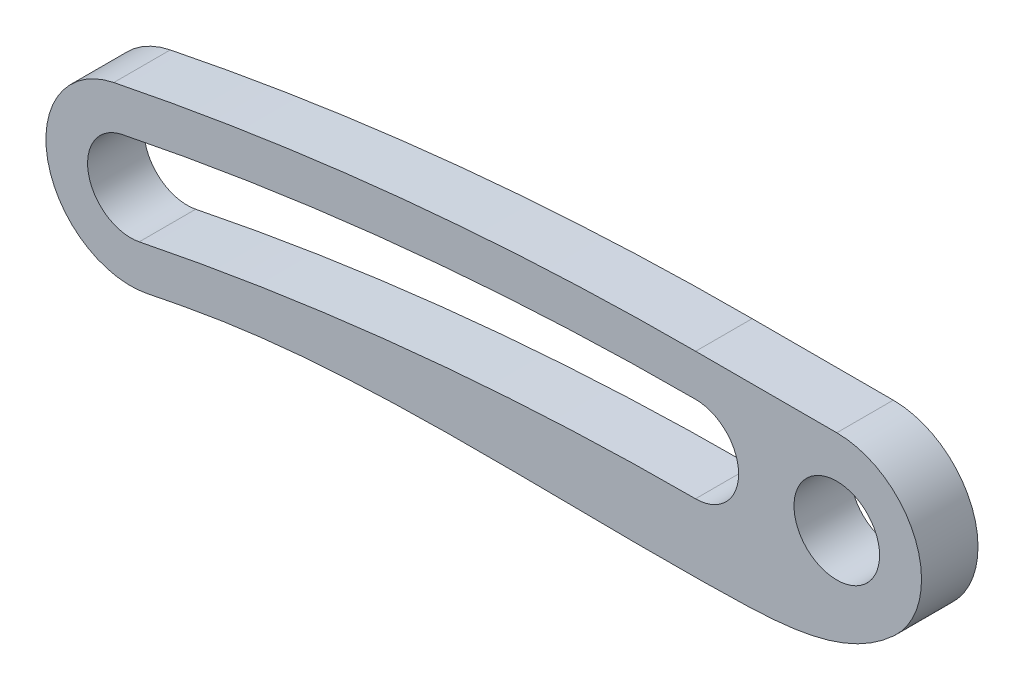
ISO-10303-21;
HEADER;
FILE_DESCRIPTION(('STEP AP214'),'2;1');
FILE_NAME('part.step','',(''),(''),'','','');
FILE_SCHEMA(('AUTOMOTIVE_DESIGN { 1 0 10303 214 1 1 1 1 }'));
ENDSEC;
DATA;
#1=APPLICATION_CONTEXT('core data for automotive mechanical design processes');
#2=APPLICATION_PROTOCOL_DEFINITION('international standard','automotive_design',2000,#1);
#3=PRODUCT_CONTEXT('',#1,'mechanical');
#4=PRODUCT('Part','Part','',(#3));
#5=PRODUCT_RELATED_PRODUCT_CATEGORY('part','',(#4));
#6=PRODUCT_DEFINITION_FORMATION('','',#4);
#7=PRODUCT_DEFINITION_CONTEXT('part definition',#1,'design');
#8=PRODUCT_DEFINITION('design','',#6,#7);
#9=PRODUCT_DEFINITION_SHAPE('','',#8);
#10=(LENGTH_UNIT() NAMED_UNIT(*) SI_UNIT(.MILLI.,.METRE.));
#11=(NAMED_UNIT(*) PLANE_ANGLE_UNIT() SI_UNIT($,.RADIAN.));
#12=(NAMED_UNIT(*) SI_UNIT($,.STERADIAN.) SOLID_ANGLE_UNIT());
#13=UNCERTAINTY_MEASURE_WITH_UNIT(LENGTH_MEASURE(1.E-05),#10,'distance_accuracy_value','');
#14=(GEOMETRIC_REPRESENTATION_CONTEXT(3) GLOBAL_UNCERTAINTY_ASSIGNED_CONTEXT((#13)) GLOBAL_UNIT_ASSIGNED_CONTEXT((#10,
#11,#12)) REPRESENTATION_CONTEXT('',''));
#15=CARTESIAN_POINT('',(0.,0.,0.));
#16=DIRECTION('',(0.,0.,1.));
#17=DIRECTION('',(1.,0.,0.));
#18=AXIS2_PLACEMENT_3D('',#15,#16,#17);
#19=CARTESIAN_POINT('',(-5.10000500050131,-99.9999499949869,2.));
#20=DIRECTION('',(0.,0.,-1.));
#21=DIRECTION('',(-1.,0.,0.));
#22=AXIS2_PLACEMENT_3D('',#19,#20,#21);
#23=CYLINDRICAL_SURFACE('',#22,97.0000074303893);
#24=CARTESIAN_POINT('',(-5.10000500050131,-99.9999499949869,0.));
#25=DIRECTION('',(0.,0.,1.));
#26=DIRECTION('',(1.,0.,0.));
#27=AXIS2_PLACEMENT_3D('',#24,#25,#26);
#28=CIRCLE('',#27,97.0000074303893);
#29=CARTESIAN_POINT('',(-23.0767639053132,-4.68029000412327,0.));
#30=VERTEX_POINT('',#29);
#31=CARTESIAN_POINT('',(-24.4030014926821,-4.93999188772206,0.));
#32=VERTEX_POINT('',#31);
#33=EDGE_CURVE('E135',#30,#32,#28,.T.);
#34=ORIENTED_EDGE('',*,*,#33,.F.);
#35=DIRECTION('',(0.,0.,1.));
#36=VECTOR('',#35,1.);
#37=CARTESIAN_POINT('',(-23.0767639053132,-4.68029000412327,0.));
#38=LINE('',#37,#36);
#39=CARTESIAN_POINT('',(-23.0767639053132,-4.68029000412327,2.));
#40=VERTEX_POINT('',#39);
#41=EDGE_CURVE('E72',#30,#40,#38,.T.);
#42=ORIENTED_EDGE('',*,*,#41,.T.);
#43=CARTESIAN_POINT('',(-5.10000500050131,-99.9999499949869,2.));
#44=DIRECTION('',(0.,0.,1.));
#45=DIRECTION('',(1.,0.,0.));
#46=AXIS2_PLACEMENT_3D('',#43,#44,#45);
#47=CIRCLE('',#46,97.0000074303893);
#48=CARTESIAN_POINT('',(-24.4030014926821,-4.93999188772206,2.));
#49=VERTEX_POINT('',#48);
#50=EDGE_CURVE('E245',#40,#49,#47,.T.);
#51=ORIENTED_EDGE('',*,*,#50,.T.);
#52=DIRECTION('',(0.,0.,-1.));
#53=VECTOR('',#52,1.);
#54=CARTESIAN_POINT('',(-24.4030014926821,-4.93999188772206,2.));
#55=LINE('',#54,#53);
#56=EDGE_CURVE('E200',#49,#32,#55,.T.);
#57=ORIENTED_EDGE('',*,*,#56,.T.);
#58=EDGE_LOOP('',(#34,#42,#51,#57));
#59=FACE_BOUND('',#58,.T.);
#60=ADVANCED_FACE('F47',(#59),#23,.F.);
#61=CARTESIAN_POINT('',(0.,0.,2.));
#62=DIRECTION('',(0.,0.,-1.));
#63=DIRECTION('',(-1.,0.,0.));
#64=AXIS2_PLACEMENT_3D('',#61,#62,#63);
#65=CYLINDRICAL_SURFACE('',#64,3.);
#66=DIRECTION('',(0.,0.,1.));
#67=VECTOR('',#66,1.);
#68=CARTESIAN_POINT('',(2.03530989954389,-2.20397677229563,0.));
#69=LINE('',#68,#67);
#70=CARTESIAN_POINT('',(2.03530989954389,-2.20397677229563,0.));
#71=VERTEX_POINT('',#70);
#72=CARTESIAN_POINT('',(2.03530989954389,-2.20397677229563,2.));
#73=VERTEX_POINT('',#72);
#74=EDGE_CURVE('E137',#71,#73,#69,.T.);
#75=ORIENTED_EDGE('',*,*,#74,.F.);
#76=CARTESIAN_POINT('',(0.,0.,0.));
#77=DIRECTION('',(0.,0.,1.));
#78=DIRECTION('',(1.,0.,0.));
#79=AXIS2_PLACEMENT_3D('',#76,#77,#78);
#80=CIRCLE('',#79,3.);
#81=CARTESIAN_POINT('',(-4.50099039006613E-06,2.99999999999662,0.));
#82=VERTEX_POINT('',#81);
#83=EDGE_CURVE('E126',#71,#82,#80,.T.);
#84=ORIENTED_EDGE('',*,*,#83,.T.);
#85=DIRECTION('',(0.,0.,-1.));
#86=VECTOR('',#85,1.);
#87=CARTESIAN_POINT('',(-4.50099039006613E-06,2.99999999999662,2.));
#88=LINE('',#87,#86);
#89=CARTESIAN_POINT('',(-4.50099039006613E-06,2.99999999999662,2.));
#90=VERTEX_POINT('',#89);
#91=EDGE_CURVE('E51',#90,#82,#88,.T.);
#92=ORIENTED_EDGE('',*,*,#91,.F.);
#93=CARTESIAN_POINT('',(0.,0.,2.));
#94=DIRECTION('',(0.,0.,1.));
#95=DIRECTION('',(1.,0.,0.));
#96=AXIS2_PLACEMENT_3D('',#93,#94,#95);
#97=CIRCLE('',#96,3.);
#98=EDGE_CURVE('E64',#73,#90,#97,.T.);
#99=ORIENTED_EDGE('',*,*,#98,.F.);
#100=EDGE_LOOP('',(#75,#84,#92,#99));
#101=FACE_BOUND('',#100,.T.);
#102=ADVANCED_FACE('F138',(#101),#65,.T.);
#103=CARTESIAN_POINT('',(-5.10000500050131,-99.9999499949869,2.));
#104=DIRECTION('',(0.,0.,-1.));
#105=DIRECTION('',(-1.,0.,0.));
#106=AXIS2_PLACEMENT_3D('',#103,#104,#105);
#107=CYLINDRICAL_SURFACE('',#106,101.525);
#108=CARTESIAN_POINT('',(-5.10000500050131,-99.9999499949869,0.));
#109=DIRECTION('',(0.,0.,1.));
#110=DIRECTION('',(1.,0.,0.));
#111=AXIS2_PLACEMENT_3D('',#108,#109,#110);
#112=CIRCLE('',#111,101.525);
#113=CARTESIAN_POINT('',(-4.99847492374236,1.52499923742355,0.));
#114=VERTEX_POINT('',#113);
#115=CARTESIAN_POINT('',(-25.3034749237424,-0.505500762576451,0.));
#116=VERTEX_POINT('',#115);
#117=EDGE_CURVE('E213',#114,#116,#112,.T.);
#118=ORIENTED_EDGE('',*,*,#117,.F.);
#119=DIRECTION('',(0.,0.,-1.));
#120=VECTOR('',#119,1.);
#121=CARTESIAN_POINT('',(-4.99847492374236,1.52499923742355,2.));
#122=LINE('',#121,#120);
#123=CARTESIAN_POINT('',(-4.99847492374236,1.52499923742355,2.));
#124=VERTEX_POINT('',#123);
#125=EDGE_CURVE('E12',#124,#114,#122,.T.);
#126=ORIENTED_EDGE('',*,*,#125,.F.);
#127=CARTESIAN_POINT('',(-5.10000500050131,-99.9999499949869,2.));
#128=DIRECTION('',(0.,0.,1.));
#129=DIRECTION('',(1.,0.,0.));
#130=AXIS2_PLACEMENT_3D('',#127,#128,#129);
#131=CIRCLE('',#130,101.525);
#132=CARTESIAN_POINT('',(-25.3034749237424,-0.505500762576451,2.));
#133=VERTEX_POINT('',#132);
#134=EDGE_CURVE('E261',#124,#133,#131,.T.);
#135=ORIENTED_EDGE('',*,*,#134,.T.);
#136=DIRECTION('',(0.,0.,-1.));
#137=VECTOR('',#136,1.);
#138=CARTESIAN_POINT('',(-25.3034749237424,-0.505500762576451,2.));
#139=LINE('',#138,#137);
#140=EDGE_CURVE('E226',#133,#116,#139,.T.);
#141=ORIENTED_EDGE('',*,*,#140,.T.);
#142=EDGE_LOOP('',(#118,#126,#135,#141));
#143=FACE_BOUND('',#142,.T.);
#144=ADVANCED_FACE('F178',(#143),#107,.F.);
#145=CARTESIAN_POINT('',(-5.,0.,2.));
#146=DIRECTION('',(0.,0.,-1.));
#147=DIRECTION('',(-1.,0.,0.));
#148=AXIS2_PLACEMENT_3D('',#145,#146,#147);
#149=CYLINDRICAL_SURFACE('',#148,1.525);
#150=CARTESIAN_POINT('',(-5.,0.,0.));
#151=DIRECTION('',(0.,0.,1.));
#152=DIRECTION('',(1.,0.,0.));
#153=AXIS2_PLACEMENT_3D('',#150,#151,#152);
#154=CIRCLE('',#153,1.525);
#155=CARTESIAN_POINT('',(-5.00152507625764,-1.52499923742355,0.));
#156=VERTEX_POINT('',#155);
#157=EDGE_CURVE('E216',#156,#114,#154,.T.);
#158=ORIENTED_EDGE('',*,*,#157,.F.);
#159=DIRECTION('',(0.,0.,-1.));
#160=VECTOR('',#159,1.);
#161=CARTESIAN_POINT('',(-5.00152507625764,-1.52499923742355,2.));
#162=LINE('',#161,#160);
#163=CARTESIAN_POINT('',(-5.00152507625764,-1.52499923742355,2.));
#164=VERTEX_POINT('',#163);
#165=EDGE_CURVE('E56',#164,#156,#162,.T.);
#166=ORIENTED_EDGE('',*,*,#165,.F.);
#167=CARTESIAN_POINT('',(-5.,0.,2.));
#168=DIRECTION('',(0.,0.,1.));
#169=DIRECTION('',(1.,0.,0.));
#170=AXIS2_PLACEMENT_3D('',#167,#168,#169);
#171=CIRCLE('',#170,1.525);
#172=EDGE_CURVE('E265',#164,#124,#171,.T.);
#173=ORIENTED_EDGE('',*,*,#172,.T.);
#174=ORIENTED_EDGE('',*,*,#125,.T.);
#175=EDGE_LOOP('',(#158,#166,#173,#174));
#176=FACE_BOUND('',#175,.T.);
#177=ADVANCED_FACE('F174',(#176),#149,.F.);
#178=CARTESIAN_POINT('',(-5.10000500050131,-99.9999499949869,2.));
#179=DIRECTION('',(0.,0.,-1.));
#180=DIRECTION('',(-1.,0.,0.));
#181=AXIS2_PLACEMENT_3D('',#178,#179,#180);
#182=CYLINDRICAL_SURFACE('',#181,98.475);
#183=CARTESIAN_POINT('',(-5.10000500050131,-99.9999499949869,0.));
#184=DIRECTION('',(0.,0.,1.));
#185=DIRECTION('',(1.,0.,0.));
#186=AXIS2_PLACEMENT_3D('',#183,#184,#185);
#187=CIRCLE('',#186,98.475);
#188=CARTESIAN_POINT('',(-24.6965250762576,-3.49449923742355,0.));
#189=VERTEX_POINT('',#188);
#190=EDGE_CURVE('E219',#156,#189,#187,.T.);
#191=ORIENTED_EDGE('',*,*,#190,.T.);
#192=DIRECTION('',(0.,0.,-1.));
#193=VECTOR('',#192,1.);
#194=CARTESIAN_POINT('',(-24.6965250762576,-3.49449923742355,2.));
#195=LINE('',#194,#193);
#196=CARTESIAN_POINT('',(-24.6965250762576,-3.49449923742355,2.));
#197=VERTEX_POINT('',#196);
#198=EDGE_CURVE('E228',#197,#189,#195,.T.);
#199=ORIENTED_EDGE('',*,*,#198,.F.);
#200=CARTESIAN_POINT('',(-5.10000500050131,-99.9999499949869,2.));
#201=DIRECTION('',(0.,0.,1.));
#202=DIRECTION('',(1.,0.,0.));
#203=AXIS2_PLACEMENT_3D('',#200,#201,#202);
#204=CIRCLE('',#203,98.475);
#205=EDGE_CURVE('E269',#164,#197,#204,.T.);
#206=ORIENTED_EDGE('',*,*,#205,.F.);
#207=ORIENTED_EDGE('',*,*,#165,.T.);
#208=EDGE_LOOP('',(#191,#199,#206,#207));
#209=FACE_BOUND('',#208,.T.);
#210=ADVANCED_FACE('F170',(#209),#182,.T.);
#211=CARTESIAN_POINT('',(-4.50099039022527E-06,2.99999999999662,2.));
#212=DIRECTION('',(-1.50033013007509E-06,0.999999999998875,0.));
#213=DIRECTION('',(-0.999999999998875,-1.50033013007509E-06,0.));
#214=AXIS2_PLACEMENT_3D('',#211,#212,#213);
#215=PLANE('',#214);
#216=DIRECTION('',(0.999999999998875,1.50033013007509E-06,0.));
#217=VECTOR('',#216,1.);
#218=CARTESIAN_POINT('',(-4.50099039022527E-06,2.99999999999662,0.));
#219=LINE('',#218,#217);
#220=CARTESIAN_POINT('',(-4.99699985598226,2.99999250285393,0.));
#221=VERTEX_POINT('',#220);
#222=EDGE_CURVE('E133',#221,#82,#219,.T.);
#223=ORIENTED_EDGE('',*,*,#222,.F.);
#224=DIRECTION('',(0.,0.,-1.));
#225=VECTOR('',#224,1.);
#226=CARTESIAN_POINT('',(-4.99699985598226,2.99999250285393,2.));
#227=LINE('',#226,#225);
#228=CARTESIAN_POINT('',(-4.99699985598226,2.99999250285393,2.));
#229=VERTEX_POINT('',#228);
#230=EDGE_CURVE('E234',#229,#221,#227,.T.);
#231=ORIENTED_EDGE('',*,*,#230,.F.);
#232=DIRECTION('',(0.999999999998875,1.50033013007509E-06,0.));
#233=VECTOR('',#232,1.);
#234=CARTESIAN_POINT('',(-4.50099039022527E-06,2.99999999999662,2.));
#235=LINE('',#234,#233);
#236=EDGE_CURVE('E239',#229,#90,#235,.T.);
#237=ORIENTED_EDGE('',*,*,#236,.T.);
#238=ORIENTED_EDGE('',*,*,#91,.T.);
#239=EDGE_LOOP('',(#223,#231,#237,#238));
#240=FACE_BOUND('',#239,.T.);
#241=ADVANCED_FACE('F173',(#240),#215,.T.);
#242=CARTESIAN_POINT('',(-5.10000500050131,-99.9999499949869,2.));
#243=DIRECTION('',(0.,0.,-1.));
#244=DIRECTION('',(-1.,0.,0.));
#245=AXIS2_PLACEMENT_3D('',#242,#243,#244);
#246=CYLINDRICAL_SURFACE('',#245,102.999993913046);
#247=CARTESIAN_POINT('',(-5.10000500050131,-99.9999499949869,0.));
#248=DIRECTION('',(0.,0.,1.));
#249=DIRECTION('',(1.,0.,0.));
#250=AXIS2_PLACEMENT_3D('',#247,#248,#249);
#251=CIRCLE('',#250,102.999993913046);
#252=CARTESIAN_POINT('',(-25.5969985073179,0.939991887722064,0.));
#253=VERTEX_POINT('',#252);
#254=EDGE_CURVE('E209',#253,#221,#251,.F.);
#255=ORIENTED_EDGE('',*,*,#254,.F.);
#256=DIRECTION('',(0.,0.,-1.));
#257=VECTOR('',#256,1.);
#258=CARTESIAN_POINT('',(-25.5969985073179,0.939991887722064,2.));
#259=LINE('',#258,#257);
#260=CARTESIAN_POINT('',(-25.5969985073179,0.939991887722064,2.));
#261=VERTEX_POINT('',#260);
#262=EDGE_CURVE('E232',#261,#253,#259,.T.);
#263=ORIENTED_EDGE('',*,*,#262,.F.);
#264=CARTESIAN_POINT('',(-5.10000500050131,-99.9999499949869,2.));
#265=DIRECTION('',(0.,0.,1.));
#266=DIRECTION('',(1.,0.,0.));
#267=AXIS2_PLACEMENT_3D('',#264,#265,#266);
#268=CIRCLE('',#267,102.999993913046);
#269=EDGE_CURVE('E241',#261,#229,#268,.F.);
#270=ORIENTED_EDGE('',*,*,#269,.T.);
#271=ORIENTED_EDGE('',*,*,#230,.T.);
#272=EDGE_LOOP('',(#255,#263,#270,#271));
#273=FACE_BOUND('',#272,.T.);
#274=ADVANCED_FACE('F186',(#273),#246,.T.);
#275=CARTESIAN_POINT('',(-25.,-2.,2.));
#276=DIRECTION('',(0.,0.,-1.));
#277=DIRECTION('',(-1.,0.,0.));
#278=AXIS2_PLACEMENT_3D('',#275,#276,#277);
#279=CYLINDRICAL_SURFACE('',#278,2.99999325292764);
#280=CARTESIAN_POINT('',(-25.,-2.,0.));
#281=DIRECTION('',(0.,0.,1.));
#282=DIRECTION('',(1.,0.,0.));
#283=AXIS2_PLACEMENT_3D('',#280,#281,#282);
#284=CIRCLE('',#283,2.99999325292764);
#285=EDGE_CURVE('E211',#253,#32,#284,.T.);
#286=ORIENTED_EDGE('',*,*,#285,.T.);
#287=ORIENTED_EDGE('',*,*,#56,.F.);
#288=CARTESIAN_POINT('',(-25.,-2.,2.));
#289=DIRECTION('',(0.,0.,1.));
#290=DIRECTION('',(1.,0.,0.));
#291=AXIS2_PLACEMENT_3D('',#288,#289,#290);
#292=CIRCLE('',#291,2.99999325292764);
#293=EDGE_CURVE('E243',#261,#49,#292,.T.);
#294=ORIENTED_EDGE('',*,*,#293,.F.);
#295=ORIENTED_EDGE('',*,*,#262,.T.);
#296=EDGE_LOOP('',(#286,#287,#294,#295));
#297=FACE_BOUND('',#296,.T.);
#298=ADVANCED_FACE('F183',(#297),#279,.T.);
#299=CARTESIAN_POINT('',(0.,0.,2.));
#300=DIRECTION('',(0.,0.,-1.));
#301=DIRECTION('',(-1.,0.,0.));
#302=AXIS2_PLACEMENT_3D('',#299,#300,#301);
#303=CYLINDRICAL_SURFACE('',#302,1.515);
#304=CARTESIAN_POINT('',(0.,0.,2.));
#305=DIRECTION('',(0.,0.,1.));
#306=DIRECTION('',(1.,0.,0.));
#307=AXIS2_PLACEMENT_3D('',#304,#305,#306);
#308=CIRCLE('',#307,1.515);
#309=CARTESIAN_POINT('',(1.515,0.,2.));
#310=VERTEX_POINT('',#309);
#311=EDGE_CURVE('E225',#310,#310,#308,.T.);
#312=ORIENTED_EDGE('',*,*,#311,.T.);
#313=EDGE_LOOP('',(#312));
#314=FACE_BOUND('',#313,.T.);
#315=CARTESIAN_POINT('',(0.,0.,0.));
#316=DIRECTION('',(0.,0.,1.));
#317=DIRECTION('',(1.,0.,0.));
#318=AXIS2_PLACEMENT_3D('',#315,#316,#317);
#319=CIRCLE('',#318,1.515);
#320=CARTESIAN_POINT('',(1.515,0.,0.));
#321=VERTEX_POINT('',#320);
#322=EDGE_CURVE('E203',#321,#321,#319,.T.);
#323=ORIENTED_EDGE('',*,*,#322,.F.);
#324=EDGE_LOOP('',(#323));
#325=FACE_BOUND('',#324,.T.);
#326=ADVANCED_FACE('F49',(#314,#325),#303,.F.);
#327=CARTESIAN_POINT('',(-25.,-2.,2.));
#328=DIRECTION('',(0.,0.,-1.));
#329=DIRECTION('',(-1.,0.,0.));
#330=AXIS2_PLACEMENT_3D('',#327,#328,#329);
#331=CYLINDRICAL_SURFACE('',#330,1.525);
#332=CARTESIAN_POINT('',(-25.,-2.,0.));
#333=DIRECTION('',(0.,0.,1.));
#334=DIRECTION('',(1.,0.,0.));
#335=AXIS2_PLACEMENT_3D('',#332,#333,#334);
#336=CIRCLE('',#335,1.525);
#337=EDGE_CURVE('E222',#116,#189,#336,.T.);
#338=ORIENTED_EDGE('',*,*,#337,.F.);
#339=ORIENTED_EDGE('',*,*,#140,.F.);
#340=CARTESIAN_POINT('',(-25.,-2.,2.));
#341=DIRECTION('',(0.,0.,1.));
#342=DIRECTION('',(1.,0.,0.));
#343=AXIS2_PLACEMENT_3D('',#340,#341,#342);
#344=CIRCLE('',#343,1.525);
#345=EDGE_CURVE('E233',#133,#197,#344,.T.);
#346=ORIENTED_EDGE('',*,*,#345,.T.);
#347=ORIENTED_EDGE('',*,*,#198,.T.);
#348=EDGE_LOOP('',(#338,#339,#346,#347));
#349=FACE_BOUND('',#348,.T.);
#350=ADVANCED_FACE('F163',(#349),#331,.F.);
#351=CARTESIAN_POINT('',(0.,0.,2.));
#352=DIRECTION('',(0.,0.,1.));
#353=DIRECTION('',(1.,0.,0.));
#354=AXIS2_PLACEMENT_3D('',#351,#352,#353);
#355=PLANE('',#354);
#356=ORIENTED_EDGE('',*,*,#50,.F.);
#357=CARTESIAN_POINT('',(2.03530989954389,-2.20397677229562,2.));
#358=CARTESIAN_POINT('',(0.364621674930731,-3.74680985717646,2.));
#359=CARTESIAN_POINT('',(-8.35368557330075,-4.2522550188874,2.));
#360=CARTESIAN_POINT('',(-16.6670648833765,-3.47145703410362,2.));
#361=CARTESIAN_POINT('',(-23.0767637786758,-4.68029067560296,2.));
#362=B_SPLINE_CURVE_WITH_KNOTS('',3,(#357,#358,#359,#360,#361),.UNSPECIFIED.,.F.,.F.,(4,1,4),
(0.,0.237995805620957,1.),.UNSPECIFIED.);
#363=EDGE_CURVE('E144',#73,#40,#362,.T.);
#364=ORIENTED_EDGE('',*,*,#363,.F.);
#365=ORIENTED_EDGE('',*,*,#98,.T.);
#366=ORIENTED_EDGE('',*,*,#236,.F.);
#367=ORIENTED_EDGE('',*,*,#269,.F.);
#368=ORIENTED_EDGE('',*,*,#293,.T.);
#369=EDGE_LOOP('',(#356,#364,#365,#366,#367,#368));
#370=FACE_BOUND('',#369,.T.);
#371=ORIENTED_EDGE('',*,*,#311,.F.);
#372=EDGE_LOOP('',(#371));
#373=FACE_BOUND('',#372,.T.);
#374=ORIENTED_EDGE('',*,*,#134,.F.);
#375=ORIENTED_EDGE('',*,*,#172,.F.);
#376=ORIENTED_EDGE('',*,*,#205,.T.);
#377=ORIENTED_EDGE('',*,*,#345,.F.);
#378=EDGE_LOOP('',(#374,#375,#376,#377));
#379=FACE_BOUND('',#378,.T.);
#380=ADVANCED_FACE('F160',(#370,#373,#379),#355,.T.);
#381=CARTESIAN_POINT('',(0.,0.,0.));
#382=DIRECTION('',(0.,0.,1.));
#383=DIRECTION('',(1.,0.,0.));
#384=AXIS2_PLACEMENT_3D('',#381,#382,#383);
#385=PLANE('',#384);
#386=CARTESIAN_POINT('',(2.03530989954389,-2.20397677229562,0.));
#387=CARTESIAN_POINT('',(0.364621674930731,-3.74680985717646,0.));
#388=CARTESIAN_POINT('',(-8.35368557330075,-4.2522550188874,0.));
#389=CARTESIAN_POINT('',(-16.6670648833765,-3.47145703410362,0.));
#390=CARTESIAN_POINT('',(-23.0767637786758,-4.68029067560296,0.));
#391=B_SPLINE_CURVE_WITH_KNOTS('',3,(#386,#387,#388,#389,#390),.UNSPECIFIED.,.F.,.F.,(4,1,4),
(0.,0.237995805620957,1.),.UNSPECIFIED.);
#392=EDGE_CURVE('E130',#71,#30,#391,.T.);
#393=ORIENTED_EDGE('',*,*,#392,.T.);
#394=ORIENTED_EDGE('',*,*,#33,.T.);
#395=ORIENTED_EDGE('',*,*,#285,.F.);
#396=ORIENTED_EDGE('',*,*,#254,.T.);
#397=ORIENTED_EDGE('',*,*,#222,.T.);
#398=ORIENTED_EDGE('',*,*,#83,.F.);
#399=EDGE_LOOP('',(#393,#394,#395,#396,#397,#398));
#400=FACE_BOUND('',#399,.T.);
#401=ORIENTED_EDGE('',*,*,#322,.T.);
#402=EDGE_LOOP('',(#401));
#403=FACE_BOUND('',#402,.T.);
#404=ORIENTED_EDGE('',*,*,#117,.T.);
#405=ORIENTED_EDGE('',*,*,#337,.T.);
#406=ORIENTED_EDGE('',*,*,#190,.F.);
#407=ORIENTED_EDGE('',*,*,#157,.T.);
#408=EDGE_LOOP('',(#404,#405,#406,#407));
#409=FACE_BOUND('',#408,.T.);
#410=ADVANCED_FACE('F127',(#400,#403,#409),#385,.F.);
#411=DIRECTION('',(0.,0.,1.));
#412=VECTOR('',#411,1.);
#413=SURFACE_OF_LINEAR_EXTRUSION('',#391,#412);
#414=ORIENTED_EDGE('',*,*,#363,.T.);
#415=ORIENTED_EDGE('',*,*,#41,.F.);
#416=ORIENTED_EDGE('',*,*,#392,.F.);
#417=ORIENTED_EDGE('',*,*,#74,.T.);
#418=EDGE_LOOP('',(#414,#415,#416,#417));
#419=FACE_BOUND('',#418,.T.);
#420=ADVANCED_FACE('F143',(#419),#413,.F.);
#421=CLOSED_SHELL('',(#60,#102,#144,#177,#210,#241,#274,#298,#326,#350,#380,#410,#420));
#422=MANIFOLD_SOLID_BREP('B2',#421);
#423=ADVANCED_BREP_SHAPE_REPRESENTATION('',(#18,#422),#14);
#424=SHAPE_DEFINITION_REPRESENTATION(#9,#423);
ENDSEC;
END-ISO-10303-21;
